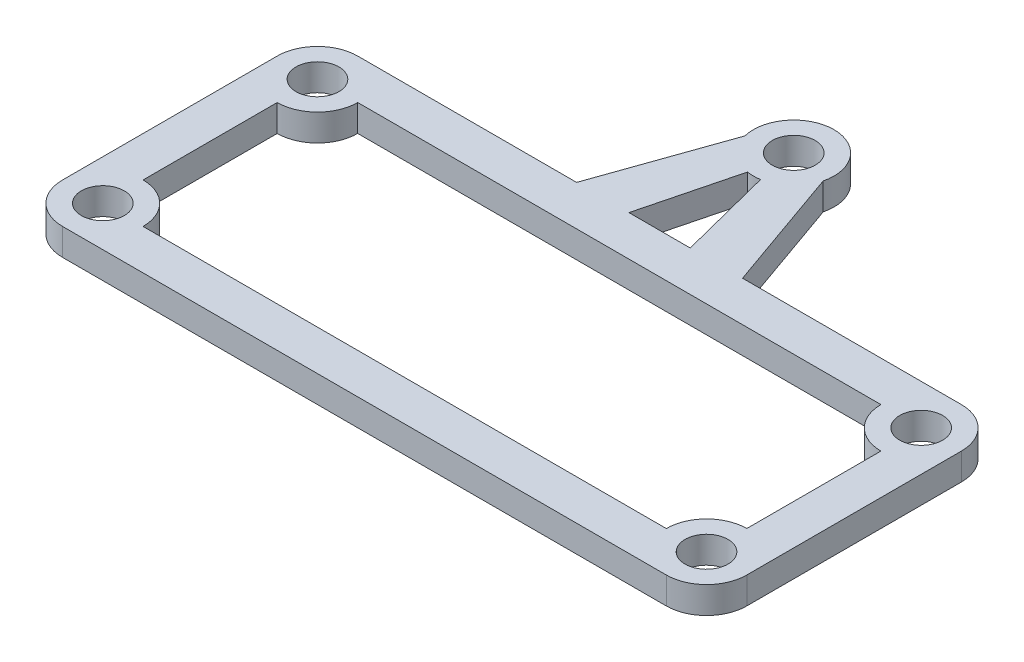
ISO-10303-21;
HEADER;
FILE_DESCRIPTION(('STEP AP214'),'2;1');
FILE_NAME('part.step','',(''),(''),'','','');
FILE_SCHEMA(('AUTOMOTIVE_DESIGN { 1 0 10303 214 1 1 1 1 }'));
ENDSEC;
DATA;
#1=APPLICATION_CONTEXT('core data for automotive mechanical design processes');
#2=APPLICATION_PROTOCOL_DEFINITION('international standard','automotive_design',2000,#1);
#3=PRODUCT_CONTEXT('',#1,'mechanical');
#4=PRODUCT('Part','Part','',(#3));
#5=PRODUCT_RELATED_PRODUCT_CATEGORY('part','',(#4));
#6=PRODUCT_DEFINITION_FORMATION('','',#4);
#7=PRODUCT_DEFINITION_CONTEXT('part definition',#1,'design');
#8=PRODUCT_DEFINITION('design','',#6,#7);
#9=PRODUCT_DEFINITION_SHAPE('','',#8);
#10=(LENGTH_UNIT() NAMED_UNIT(*) SI_UNIT(.MILLI.,.METRE.));
#11=(NAMED_UNIT(*) PLANE_ANGLE_UNIT() SI_UNIT($,.RADIAN.));
#12=(NAMED_UNIT(*) SI_UNIT($,.STERADIAN.) SOLID_ANGLE_UNIT());
#13=UNCERTAINTY_MEASURE_WITH_UNIT(LENGTH_MEASURE(1.E-05),#10,'distance_accuracy_value','');
#14=(GEOMETRIC_REPRESENTATION_CONTEXT(3) GLOBAL_UNCERTAINTY_ASSIGNED_CONTEXT((#13)) GLOBAL_UNIT_ASSIGNED_CONTEXT((#10,
#11,#12)) REPRESENTATION_CONTEXT('',''));
#15=CARTESIAN_POINT('',(0.,0.,0.));
#16=DIRECTION('',(0.,0.,1.));
#17=DIRECTION('',(1.,0.,0.));
#18=AXIS2_PLACEMENT_3D('',#15,#16,#17);
#19=CARTESIAN_POINT('',(22.5,2.,-8.));
#20=DIRECTION('',(0.,1.,0.));
#21=DIRECTION('',(0.,0.,1.));
#22=AXIS2_PLACEMENT_3D('',#19,#20,#21);
#23=PLANE('',#22);
#24=CARTESIAN_POINT('',(22.5,2.,-8.));
#25=DIRECTION('',(0.,1.,0.));
#26=DIRECTION('',(0.,0.,1.));
#27=AXIS2_PLACEMENT_3D('',#24,#25,#26);
#28=CIRCLE('',#27,1.6);
#29=CARTESIAN_POINT('',(22.5,2.,-6.4));
#30=VERTEX_POINT('',#29);
#31=EDGE_CURVE('E295',#30,#30,#28,.T.);
#32=ORIENTED_EDGE('',*,*,#31,.F.);
#33=EDGE_LOOP('',(#32));
#34=FACE_BOUND('',#33,.T.);
#35=CARTESIAN_POINT('',(-22.5,2.,8.));
#36=DIRECTION('',(0.,1.,0.));
#37=DIRECTION('',(0.,0.,1.));
#38=AXIS2_PLACEMENT_3D('',#35,#36,#37);
#39=CIRCLE('',#38,1.6);
#40=CARTESIAN_POINT('',(-22.5,2.,9.6));
#41=VERTEX_POINT('',#40);
#42=EDGE_CURVE('E307',#41,#41,#39,.T.);
#43=ORIENTED_EDGE('',*,*,#42,.F.);
#44=EDGE_LOOP('',(#43));
#45=FACE_BOUND('',#44,.T.);
#46=DIRECTION('',(-0.332613286751948,0.,-0.943063307247221));
#47=VECTOR('',#46,1.);
#48=CARTESIAN_POINT('',(2.91219709152481,2.,-20.2795084316146));
#49=LINE('',#48,#47);
#50=CARTESIAN_POINT('',(6.18502912216667,2.,-11.));
#51=VERTEX_POINT('',#50);
#52=CARTESIAN_POINT('',(2.91219709152481,2.,-20.2795084316146));
#53=VERTEX_POINT('',#52);
#54=EDGE_CURVE('E319',#51,#53,#49,.T.);
#55=ORIENTED_EDGE('',*,*,#54,.T.);
#56=CARTESIAN_POINT('',(0.,2.,-21.));
#57=DIRECTION('',(0.,1.,0.));
#58=DIRECTION('',(0.,0.,1.));
#59=AXIS2_PLACEMENT_3D('',#56,#57,#58);
#60=CIRCLE('',#59,3.);
#61=CARTESIAN_POINT('',(-2.91219709152481,2.,-20.2795084316146));
#62=VERTEX_POINT('',#61);
#63=EDGE_CURVE('E322',#53,#62,#60,.T.);
#64=ORIENTED_EDGE('',*,*,#63,.T.);
#65=DIRECTION('',(-0.332613286751948,0.,0.943063307247221));
#66=VECTOR('',#65,1.);
#67=CARTESIAN_POINT('',(-2.91219709152481,2.,-20.2795084316146));
#68=LINE('',#67,#66);
#69=CARTESIAN_POINT('',(-6.18502912216668,2.,-11.));
#70=VERTEX_POINT('',#69);
#71=EDGE_CURVE('E325',#62,#70,#68,.T.);
#72=ORIENTED_EDGE('',*,*,#71,.T.);
#73=DIRECTION('',(-1.,0.,0.));
#74=VECTOR('',#73,1.);
#75=CARTESIAN_POINT('',(-22.5,2.,-11.));
#76=LINE('',#75,#74);
#77=CARTESIAN_POINT('',(-22.5,2.,-11.));
#78=VERTEX_POINT('',#77);
#79=EDGE_CURVE('E327',#70,#78,#76,.T.);
#80=ORIENTED_EDGE('',*,*,#79,.T.);
#81=CARTESIAN_POINT('',(-22.5,2.,-8.));
#82=DIRECTION('',(0.,1.,0.));
#83=DIRECTION('',(0.,0.,1.));
#84=AXIS2_PLACEMENT_3D('',#81,#82,#83);
#85=CIRCLE('',#84,3.);
#86=CARTESIAN_POINT('',(-25.5,2.,-8.));
#87=VERTEX_POINT('',#86);
#88=EDGE_CURVE('E329',#78,#87,#85,.T.);
#89=ORIENTED_EDGE('',*,*,#88,.T.);
#90=DIRECTION('',(0.,0.,1.));
#91=VECTOR('',#90,1.);
#92=CARTESIAN_POINT('',(-25.5,2.,-8.));
#93=LINE('',#92,#91);
#94=CARTESIAN_POINT('',(-25.5,2.,8.));
#95=VERTEX_POINT('',#94);
#96=EDGE_CURVE('E331',#87,#95,#93,.T.);
#97=ORIENTED_EDGE('',*,*,#96,.T.);
#98=CARTESIAN_POINT('',(-22.5,2.,8.));
#99=DIRECTION('',(0.,1.,0.));
#100=DIRECTION('',(0.,0.,1.));
#101=AXIS2_PLACEMENT_3D('',#98,#99,#100);
#102=CIRCLE('',#101,3.);
#103=CARTESIAN_POINT('',(-22.5,2.,11.));
#104=VERTEX_POINT('',#103);
#105=EDGE_CURVE('E333',#95,#104,#102,.T.);
#106=ORIENTED_EDGE('',*,*,#105,.T.);
#107=DIRECTION('',(1.,0.,0.));
#108=VECTOR('',#107,1.);
#109=CARTESIAN_POINT('',(-22.5,2.,11.));
#110=LINE('',#109,#108);
#111=CARTESIAN_POINT('',(22.5,2.,11.));
#112=VERTEX_POINT('',#111);
#113=EDGE_CURVE('E335',#104,#112,#110,.T.);
#114=ORIENTED_EDGE('',*,*,#113,.T.);
#115=CARTESIAN_POINT('',(22.5,2.,8.));
#116=DIRECTION('',(0.,1.,0.));
#117=DIRECTION('',(0.,0.,1.));
#118=AXIS2_PLACEMENT_3D('',#115,#116,#117);
#119=CIRCLE('',#118,3.);
#120=CARTESIAN_POINT('',(25.5,2.,8.));
#121=VERTEX_POINT('',#120);
#122=EDGE_CURVE('E337',#112,#121,#119,.T.);
#123=ORIENTED_EDGE('',*,*,#122,.T.);
#124=DIRECTION('',(0.,0.,-1.));
#125=VECTOR('',#124,1.);
#126=CARTESIAN_POINT('',(25.5,2.,8.));
#127=LINE('',#126,#125);
#128=CARTESIAN_POINT('',(25.5,2.,-8.));
#129=VERTEX_POINT('',#128);
#130=EDGE_CURVE('E339',#121,#129,#127,.T.);
#131=ORIENTED_EDGE('',*,*,#130,.T.);
#132=CARTESIAN_POINT('',(22.5,2.,-8.));
#133=DIRECTION('',(0.,1.,0.));
#134=DIRECTION('',(0.,0.,1.));
#135=AXIS2_PLACEMENT_3D('',#132,#133,#134);
#136=CIRCLE('',#135,3.);
#137=CARTESIAN_POINT('',(22.5,2.,-11.));
#138=VERTEX_POINT('',#137);
#139=EDGE_CURVE('E341',#129,#138,#136,.T.);
#140=ORIENTED_EDGE('',*,*,#139,.T.);
#141=DIRECTION('',(-1.,0.,0.));
#142=VECTOR('',#141,1.);
#143=CARTESIAN_POINT('',(6.18502912216667,2.,-11.));
#144=LINE('',#143,#142);
#145=EDGE_CURVE('E343',#138,#51,#144,.T.);
#146=ORIENTED_EDGE('',*,*,#145,.T.);
#147=EDGE_LOOP('',(#55,#64,#72,#80,#89,#97,#106,#114,#123,#131,#140,#146));
#148=FACE_BOUND('',#147,.T.);
#149=CARTESIAN_POINT('',(-22.5,2.,-8.));
#150=DIRECTION('',(0.,1.,0.));
#151=DIRECTION('',(0.,0.,1.));
#152=AXIS2_PLACEMENT_3D('',#149,#150,#151);
#153=CIRCLE('',#152,1.6);
#154=CARTESIAN_POINT('',(-22.5,2.,-6.4));
#155=VERTEX_POINT('',#154);
#156=EDGE_CURVE('E313',#155,#155,#153,.T.);
#157=ORIENTED_EDGE('',*,*,#156,.F.);
#158=EDGE_LOOP('',(#157));
#159=FACE_BOUND('',#158,.T.);
#160=CARTESIAN_POINT('',(22.5,2.,8.));
#161=DIRECTION('',(0.,1.,0.));
#162=DIRECTION('',(0.,0.,1.));
#163=AXIS2_PLACEMENT_3D('',#160,#161,#162);
#164=CIRCLE('',#163,1.6);
#165=CARTESIAN_POINT('',(22.5,2.,9.6));
#166=VERTEX_POINT('',#165);
#167=EDGE_CURVE('E301',#166,#166,#164,.T.);
#168=ORIENTED_EDGE('',*,*,#167,.F.);
#169=EDGE_LOOP('',(#168));
#170=FACE_BOUND('',#169,.T.);
#171=CARTESIAN_POINT('',(0.,2.,-21.));
#172=DIRECTION('',(0.,1.,0.));
#173=DIRECTION('',(0.,0.,1.));
#174=AXIS2_PLACEMENT_3D('',#171,#172,#173);
#175=CIRCLE('',#174,1.6);
#176=CARTESIAN_POINT('',(0.,2.,-19.4));
#177=VERTEX_POINT('',#176);
#178=EDGE_CURVE('E289',#177,#177,#175,.T.);
#179=ORIENTED_EDGE('',*,*,#178,.F.);
#180=EDGE_LOOP('',(#179));
#181=FACE_BOUND('',#180,.T.);
#182=DIRECTION('',(-1.,0.,0.));
#183=VECTOR('',#182,1.);
#184=CARTESIAN_POINT('',(-19.5,2.,-8.));
#185=LINE('',#184,#183);
#186=CARTESIAN_POINT('',(19.5,2.,-8.));
#187=VERTEX_POINT('',#186);
#188=CARTESIAN_POINT('',(-19.5,2.,-8.));
#189=VERTEX_POINT('',#188);
#190=EDGE_CURVE('E232',#187,#189,#185,.T.);
#191=ORIENTED_EDGE('',*,*,#190,.F.);
#192=CARTESIAN_POINT('',(22.5,2.,-8.));
#193=DIRECTION('',(0.,-1.,0.));
#194=DIRECTION('',(0.,0.,1.));
#195=AXIS2_PLACEMENT_3D('',#192,#193,#194);
#196=CIRCLE('',#195,3.);
#197=CARTESIAN_POINT('',(22.5,2.,-5.));
#198=VERTEX_POINT('',#197);
#199=EDGE_CURVE('E230',#198,#187,#196,.T.);
#200=ORIENTED_EDGE('',*,*,#199,.F.);
#201=DIRECTION('',(0.,0.,-1.));
#202=VECTOR('',#201,1.);
#203=CARTESIAN_POINT('',(22.5,2.,5.));
#204=LINE('',#203,#202);
#205=CARTESIAN_POINT('',(22.5,2.,5.));
#206=VERTEX_POINT('',#205);
#207=EDGE_CURVE('E246',#206,#198,#204,.T.);
#208=ORIENTED_EDGE('',*,*,#207,.F.);
#209=CARTESIAN_POINT('',(22.5,2.,8.));
#210=DIRECTION('',(0.,-1.,0.));
#211=DIRECTION('',(0.,0.,1.));
#212=AXIS2_PLACEMENT_3D('',#209,#210,#211);
#213=CIRCLE('',#212,3.);
#214=CARTESIAN_POINT('',(19.5,2.,8.));
#215=VERTEX_POINT('',#214);
#216=EDGE_CURVE('E243',#215,#206,#213,.T.);
#217=ORIENTED_EDGE('',*,*,#216,.F.);
#218=DIRECTION('',(1.,0.,0.));
#219=VECTOR('',#218,1.);
#220=CARTESIAN_POINT('',(-19.5,2.,8.));
#221=LINE('',#220,#219);
#222=CARTESIAN_POINT('',(-19.5,2.,8.));
#223=VERTEX_POINT('',#222);
#224=EDGE_CURVE('E241',#223,#215,#221,.T.);
#225=ORIENTED_EDGE('',*,*,#224,.F.);
#226=CARTESIAN_POINT('',(-22.5,2.,8.));
#227=DIRECTION('',(0.,-1.,0.));
#228=DIRECTION('',(0.,0.,1.));
#229=AXIS2_PLACEMENT_3D('',#226,#227,#228);
#230=CIRCLE('',#229,3.);
#231=CARTESIAN_POINT('',(-22.5,2.,5.));
#232=VERTEX_POINT('',#231);
#233=EDGE_CURVE('E239',#232,#223,#230,.T.);
#234=ORIENTED_EDGE('',*,*,#233,.F.);
#235=DIRECTION('',(0.,0.,1.));
#236=VECTOR('',#235,1.);
#237=CARTESIAN_POINT('',(-22.5,2.,5.));
#238=LINE('',#237,#236);
#239=CARTESIAN_POINT('',(-22.5,2.,-5.));
#240=VERTEX_POINT('',#239);
#241=EDGE_CURVE('E237',#240,#232,#238,.T.);
#242=ORIENTED_EDGE('',*,*,#241,.F.);
#243=CARTESIAN_POINT('',(-22.5,2.,-8.));
#244=DIRECTION('',(0.,-1.,0.));
#245=DIRECTION('',(0.,0.,1.));
#246=AXIS2_PLACEMENT_3D('',#243,#244,#245);
#247=CIRCLE('',#246,3.);
#248=EDGE_CURVE('E235',#189,#240,#247,.T.);
#249=ORIENTED_EDGE('',*,*,#248,.F.);
#250=EDGE_LOOP('',(#191,#200,#208,#217,#225,#234,#242,#249));
#251=FACE_BOUND('',#250,.T.);
#252=DIRECTION('',(-0.247458921826023,0.,0.968898385801474));
#253=VECTOR('',#252,1.);
#254=CARTESIAN_POINT('',(-0.487430467790979,2.,-18.039862918872));
#255=LINE('',#254,#253);
#256=CARTESIAN_POINT('',(-0.487430467790979,2.,-18.039862918872));
#257=VERTEX_POINT('',#256);
#258=CARTESIAN_POINT('',(-2.28542798046721,2.,-11.));
#259=VERTEX_POINT('',#258);
#260=EDGE_CURVE('E202',#257,#259,#255,.T.);
#261=ORIENTED_EDGE('',*,*,#260,.F.);
#262=CARTESIAN_POINT('',(0.,2.,-21.));
#263=DIRECTION('',(0.,-1.,0.));
#264=DIRECTION('',(0.,0.,1.));
#265=AXIS2_PLACEMENT_3D('',#262,#263,#264);
#266=CIRCLE('',#265,3.);
#267=CARTESIAN_POINT('',(0.487430467790978,2.,-18.039862918872));
#268=VERTEX_POINT('',#267);
#269=EDGE_CURVE('E194',#268,#257,#266,.T.);
#270=ORIENTED_EDGE('',*,*,#269,.F.);
#271=DIRECTION('',(-0.247458921826023,0.,-0.968898385801474));
#272=VECTOR('',#271,1.);
#273=CARTESIAN_POINT('',(2.28542798046721,2.,-11.));
#274=LINE('',#273,#272);
#275=CARTESIAN_POINT('',(2.28542798046721,2.,-11.));
#276=VERTEX_POINT('',#275);
#277=EDGE_CURVE('E216',#276,#268,#274,.T.);
#278=ORIENTED_EDGE('',*,*,#277,.F.);
#279=DIRECTION('',(1.,0.,0.));
#280=VECTOR('',#279,1.);
#281=CARTESIAN_POINT('',(-2.28542798046721,2.,-11.));
#282=LINE('',#281,#280);
#283=EDGE_CURVE('E214',#259,#276,#282,.T.);
#284=ORIENTED_EDGE('',*,*,#283,.F.);
#285=EDGE_LOOP('',(#261,#270,#278,#284));
#286=FACE_BOUND('',#285,.T.);
#287=ADVANCED_FACE('F33',(#34,#45,#148,#159,#170,#181,#251,#286),#23,.T.);
#288=CARTESIAN_POINT('',(22.5,0.,-8.));
#289=DIRECTION('',(0.,1.,0.));
#290=DIRECTION('',(0.,0.,1.));
#291=AXIS2_PLACEMENT_3D('',#288,#289,#290);
#292=PLANE('',#291);
#293=CARTESIAN_POINT('',(22.5,0.,-8.));
#294=DIRECTION('',(0.,-1.,0.));
#295=DIRECTION('',(0.,0.,1.));
#296=AXIS2_PLACEMENT_3D('',#293,#294,#295);
#297=CIRCLE('',#296,3.);
#298=CARTESIAN_POINT('',(22.5,0.,-5.));
#299=VERTEX_POINT('',#298);
#300=CARTESIAN_POINT('',(19.5,0.,-8.));
#301=VERTEX_POINT('',#300);
#302=EDGE_CURVE('E210',#299,#301,#297,.T.);
#303=ORIENTED_EDGE('',*,*,#302,.T.);
#304=DIRECTION('',(-1.,0.,0.));
#305=VECTOR('',#304,1.);
#306=CARTESIAN_POINT('',(-19.5,0.,-8.));
#307=LINE('',#306,#305);
#308=CARTESIAN_POINT('',(-19.5,0.,-8.));
#309=VERTEX_POINT('',#308);
#310=EDGE_CURVE('E251',#301,#309,#307,.T.);
#311=ORIENTED_EDGE('',*,*,#310,.T.);
#312=CARTESIAN_POINT('',(-22.5,0.,-8.));
#313=DIRECTION('',(0.,-1.,0.));
#314=DIRECTION('',(0.,0.,1.));
#315=AXIS2_PLACEMENT_3D('',#312,#313,#314);
#316=CIRCLE('',#315,3.);
#317=CARTESIAN_POINT('',(-22.5,0.,-5.));
#318=VERTEX_POINT('',#317);
#319=EDGE_CURVE('E254',#309,#318,#316,.T.);
#320=ORIENTED_EDGE('',*,*,#319,.T.);
#321=DIRECTION('',(0.,0.,1.));
#322=VECTOR('',#321,1.);
#323=CARTESIAN_POINT('',(-22.5,0.,5.));
#324=LINE('',#323,#322);
#325=CARTESIAN_POINT('',(-22.5,0.,5.));
#326=VERTEX_POINT('',#325);
#327=EDGE_CURVE('E257',#318,#326,#324,.T.);
#328=ORIENTED_EDGE('',*,*,#327,.T.);
#329=CARTESIAN_POINT('',(-22.5,0.,8.));
#330=DIRECTION('',(0.,-1.,0.));
#331=DIRECTION('',(0.,0.,1.));
#332=AXIS2_PLACEMENT_3D('',#329,#330,#331);
#333=CIRCLE('',#332,3.);
#334=CARTESIAN_POINT('',(-19.5,0.,8.));
#335=VERTEX_POINT('',#334);
#336=EDGE_CURVE('E260',#326,#335,#333,.T.);
#337=ORIENTED_EDGE('',*,*,#336,.T.);
#338=DIRECTION('',(1.,0.,0.));
#339=VECTOR('',#338,1.);
#340=CARTESIAN_POINT('',(-19.5,0.,8.));
#341=LINE('',#340,#339);
#342=CARTESIAN_POINT('',(19.5,0.,8.));
#343=VERTEX_POINT('',#342);
#344=EDGE_CURVE('E263',#335,#343,#341,.T.);
#345=ORIENTED_EDGE('',*,*,#344,.T.);
#346=CARTESIAN_POINT('',(22.5,0.,8.));
#347=DIRECTION('',(0.,-1.,0.));
#348=DIRECTION('',(0.,0.,1.));
#349=AXIS2_PLACEMENT_3D('',#346,#347,#348);
#350=CIRCLE('',#349,3.);
#351=CARTESIAN_POINT('',(22.5,0.,5.));
#352=VERTEX_POINT('',#351);
#353=EDGE_CURVE('E266',#343,#352,#350,.T.);
#354=ORIENTED_EDGE('',*,*,#353,.T.);
#355=DIRECTION('',(0.,0.,-1.));
#356=VECTOR('',#355,1.);
#357=CARTESIAN_POINT('',(22.5,0.,5.));
#358=LINE('',#357,#356);
#359=EDGE_CURVE('E233',#352,#299,#358,.T.);
#360=ORIENTED_EDGE('',*,*,#359,.T.);
#361=EDGE_LOOP('',(#303,#311,#320,#328,#337,#345,#354,#360));
#362=FACE_BOUND('',#361,.T.);
#363=DIRECTION('',(-0.332613286751948,0.,-0.943063307247221));
#364=VECTOR('',#363,1.);
#365=CARTESIAN_POINT('',(2.91219709152481,0.,-20.2795084316146));
#366=LINE('',#365,#364);
#367=CARTESIAN_POINT('',(6.18502912216667,0.,-11.));
#368=VERTEX_POINT('',#367);
#369=CARTESIAN_POINT('',(2.91219709152481,0.,-20.2795084316146));
#370=VERTEX_POINT('',#369);
#371=EDGE_CURVE('E316',#368,#370,#366,.T.);
#372=ORIENTED_EDGE('',*,*,#371,.F.);
#373=DIRECTION('',(-1.,0.,0.));
#374=VECTOR('',#373,1.);
#375=CARTESIAN_POINT('',(6.18502912216667,0.,-11.));
#376=LINE('',#375,#374);
#377=CARTESIAN_POINT('',(22.5,0.,-11.));
#378=VERTEX_POINT('',#377);
#379=EDGE_CURVE('E323',#378,#368,#376,.T.);
#380=ORIENTED_EDGE('',*,*,#379,.F.);
#381=CARTESIAN_POINT('',(22.5,0.,-8.));
#382=DIRECTION('',(0.,1.,0.));
#383=DIRECTION('',(0.,0.,1.));
#384=AXIS2_PLACEMENT_3D('',#381,#382,#383);
#385=CIRCLE('',#384,3.);
#386=CARTESIAN_POINT('',(25.5,0.,-8.));
#387=VERTEX_POINT('',#386);
#388=EDGE_CURVE('E366',#387,#378,#385,.T.);
#389=ORIENTED_EDGE('',*,*,#388,.F.);
#390=DIRECTION('',(0.,0.,-1.));
#391=VECTOR('',#390,1.);
#392=CARTESIAN_POINT('',(25.5,0.,8.));
#393=LINE('',#392,#391);
#394=CARTESIAN_POINT('',(25.5,0.,8.));
#395=VERTEX_POINT('',#394);
#396=EDGE_CURVE('E364',#395,#387,#393,.T.);
#397=ORIENTED_EDGE('',*,*,#396,.F.);
#398=CARTESIAN_POINT('',(22.5,0.,8.));
#399=DIRECTION('',(0.,1.,0.));
#400=DIRECTION('',(0.,0.,1.));
#401=AXIS2_PLACEMENT_3D('',#398,#399,#400);
#402=CIRCLE('',#401,3.);
#403=CARTESIAN_POINT('',(22.5,0.,11.));
#404=VERTEX_POINT('',#403);
#405=EDGE_CURVE('E362',#404,#395,#402,.T.);
#406=ORIENTED_EDGE('',*,*,#405,.F.);
#407=DIRECTION('',(1.,0.,0.));
#408=VECTOR('',#407,1.);
#409=CARTESIAN_POINT('',(-22.5,0.,11.));
#410=LINE('',#409,#408);
#411=CARTESIAN_POINT('',(-22.5,0.,11.));
#412=VERTEX_POINT('',#411);
#413=EDGE_CURVE('E360',#412,#404,#410,.T.);
#414=ORIENTED_EDGE('',*,*,#413,.F.);
#415=CARTESIAN_POINT('',(-22.5,0.,8.));
#416=DIRECTION('',(0.,1.,0.));
#417=DIRECTION('',(0.,0.,1.));
#418=AXIS2_PLACEMENT_3D('',#415,#416,#417);
#419=CIRCLE('',#418,3.);
#420=CARTESIAN_POINT('',(-25.5,0.,8.));
#421=VERTEX_POINT('',#420);
#422=EDGE_CURVE('E358',#421,#412,#419,.T.);
#423=ORIENTED_EDGE('',*,*,#422,.F.);
#424=DIRECTION('',(0.,0.,1.));
#425=VECTOR('',#424,1.);
#426=CARTESIAN_POINT('',(-25.5,0.,-8.));
#427=LINE('',#426,#425);
#428=CARTESIAN_POINT('',(-25.5,0.,-8.));
#429=VERTEX_POINT('',#428);
#430=EDGE_CURVE('E356',#429,#421,#427,.T.);
#431=ORIENTED_EDGE('',*,*,#430,.F.);
#432=CARTESIAN_POINT('',(-22.5,0.,-8.));
#433=DIRECTION('',(0.,1.,0.));
#434=DIRECTION('',(0.,0.,1.));
#435=AXIS2_PLACEMENT_3D('',#432,#433,#434);
#436=CIRCLE('',#435,3.);
#437=CARTESIAN_POINT('',(-22.5,0.,-11.));
#438=VERTEX_POINT('',#437);
#439=EDGE_CURVE('E354',#438,#429,#436,.T.);
#440=ORIENTED_EDGE('',*,*,#439,.F.);
#441=DIRECTION('',(-1.,0.,0.));
#442=VECTOR('',#441,1.);
#443=CARTESIAN_POINT('',(-22.5,0.,-11.));
#444=LINE('',#443,#442);
#445=CARTESIAN_POINT('',(-6.18502912216668,0.,-11.));
#446=VERTEX_POINT('',#445);
#447=EDGE_CURVE('E352',#446,#438,#444,.T.);
#448=ORIENTED_EDGE('',*,*,#447,.F.);
#449=DIRECTION('',(-0.332613286751948,0.,0.943063307247221));
#450=VECTOR('',#449,1.);
#451=CARTESIAN_POINT('',(-2.91219709152481,0.,-20.2795084316146));
#452=LINE('',#451,#450);
#453=CARTESIAN_POINT('',(-2.91219709152481,0.,-20.2795084316146));
#454=VERTEX_POINT('',#453);
#455=EDGE_CURVE('E350',#454,#446,#452,.T.);
#456=ORIENTED_EDGE('',*,*,#455,.F.);
#457=CARTESIAN_POINT('',(0.,0.,-21.));
#458=DIRECTION('',(0.,1.,0.));
#459=DIRECTION('',(0.,0.,1.));
#460=AXIS2_PLACEMENT_3D('',#457,#458,#459);
#461=CIRCLE('',#460,3.);
#462=EDGE_CURVE('E348',#370,#454,#461,.T.);
#463=ORIENTED_EDGE('',*,*,#462,.F.);
#464=EDGE_LOOP('',(#372,#380,#389,#397,#406,#414,#423,#431,#440,#448,#456,#463));
#465=FACE_BOUND('',#464,.T.);
#466=CARTESIAN_POINT('',(-22.5,0.,-8.));
#467=DIRECTION('',(0.,1.,0.));
#468=DIRECTION('',(0.,0.,1.));
#469=AXIS2_PLACEMENT_3D('',#466,#467,#468);
#470=CIRCLE('',#469,1.6);
#471=CARTESIAN_POINT('',(-22.5,0.,-6.4));
#472=VERTEX_POINT('',#471);
#473=EDGE_CURVE('E310',#472,#472,#470,.T.);
#474=ORIENTED_EDGE('',*,*,#473,.T.);
#475=EDGE_LOOP('',(#474));
#476=FACE_BOUND('',#475,.T.);
#477=CARTESIAN_POINT('',(-22.5,0.,8.));
#478=DIRECTION('',(0.,1.,0.));
#479=DIRECTION('',(0.,0.,1.));
#480=AXIS2_PLACEMENT_3D('',#477,#478,#479);
#481=CIRCLE('',#480,1.6);
#482=CARTESIAN_POINT('',(-22.5,0.,9.6));
#483=VERTEX_POINT('',#482);
#484=EDGE_CURVE('E304',#483,#483,#481,.T.);
#485=ORIENTED_EDGE('',*,*,#484,.T.);
#486=EDGE_LOOP('',(#485));
#487=FACE_BOUND('',#486,.T.);
#488=CARTESIAN_POINT('',(22.5,0.,8.));
#489=DIRECTION('',(0.,1.,0.));
#490=DIRECTION('',(0.,0.,1.));
#491=AXIS2_PLACEMENT_3D('',#488,#489,#490);
#492=CIRCLE('',#491,1.6);
#493=CARTESIAN_POINT('',(22.5,0.,9.6));
#494=VERTEX_POINT('',#493);
#495=EDGE_CURVE('E298',#494,#494,#492,.T.);
#496=ORIENTED_EDGE('',*,*,#495,.T.);
#497=EDGE_LOOP('',(#496));
#498=FACE_BOUND('',#497,.T.);
#499=CARTESIAN_POINT('',(22.5,0.,-8.));
#500=DIRECTION('',(0.,1.,0.));
#501=DIRECTION('',(0.,0.,1.));
#502=AXIS2_PLACEMENT_3D('',#499,#500,#501);
#503=CIRCLE('',#502,1.6);
#504=CARTESIAN_POINT('',(22.5,0.,-6.4));
#505=VERTEX_POINT('',#504);
#506=EDGE_CURVE('E292',#505,#505,#503,.T.);
#507=ORIENTED_EDGE('',*,*,#506,.T.);
#508=EDGE_LOOP('',(#507));
#509=FACE_BOUND('',#508,.T.);
#510=CARTESIAN_POINT('',(0.,0.,-21.));
#511=DIRECTION('',(0.,1.,0.));
#512=DIRECTION('',(0.,0.,1.));
#513=AXIS2_PLACEMENT_3D('',#510,#511,#512);
#514=CIRCLE('',#513,1.6);
#515=CARTESIAN_POINT('',(0.,0.,-19.4));
#516=VERTEX_POINT('',#515);
#517=EDGE_CURVE('E288',#516,#516,#514,.T.);
#518=ORIENTED_EDGE('',*,*,#517,.T.);
#519=EDGE_LOOP('',(#518));
#520=FACE_BOUND('',#519,.T.);
#521=CARTESIAN_POINT('',(0.,0.,-21.));
#522=DIRECTION('',(0.,-1.,0.));
#523=DIRECTION('',(0.,0.,1.));
#524=AXIS2_PLACEMENT_3D('',#521,#522,#523);
#525=CIRCLE('',#524,3.);
#526=CARTESIAN_POINT('',(0.487430467790979,0.,-18.039862918872));
#527=VERTEX_POINT('',#526);
#528=CARTESIAN_POINT('',(-0.487430467790979,0.,-18.039862918872));
#529=VERTEX_POINT('',#528);
#530=EDGE_CURVE('E56',#527,#529,#525,.T.);
#531=ORIENTED_EDGE('',*,*,#530,.T.);
#532=DIRECTION('',(-0.247458921826023,0.,0.968898385801474));
#533=VECTOR('',#532,1.);
#534=CARTESIAN_POINT('',(-0.487430467790979,0.,-18.039862918872));
#535=LINE('',#534,#533);
#536=CARTESIAN_POINT('',(-2.28542798046721,0.,-11.));
#537=VERTEX_POINT('',#536);
#538=EDGE_CURVE('E209',#529,#537,#535,.T.);
#539=ORIENTED_EDGE('',*,*,#538,.T.);
#540=DIRECTION('',(1.,0.,0.));
#541=VECTOR('',#540,1.);
#542=CARTESIAN_POINT('',(-2.28542798046721,0.,-11.));
#543=LINE('',#542,#541);
#544=CARTESIAN_POINT('',(2.28542798046721,0.,-11.));
#545=VERTEX_POINT('',#544);
#546=EDGE_CURVE('E222',#537,#545,#543,.T.);
#547=ORIENTED_EDGE('',*,*,#546,.T.);
#548=DIRECTION('',(-0.247458921826023,0.,-0.968898385801474));
#549=VECTOR('',#548,1.);
#550=CARTESIAN_POINT('',(2.28542798046721,0.,-11.));
#551=LINE('',#550,#549);
#552=EDGE_CURVE('E203',#545,#527,#551,.T.);
#553=ORIENTED_EDGE('',*,*,#552,.T.);
#554=EDGE_LOOP('',(#531,#539,#547,#553));
#555=FACE_BOUND('',#554,.T.);
#556=ADVANCED_FACE('F408',(#362,#465,#476,#487,#498,#509,#520,#555),#292,.F.);
#557=CARTESIAN_POINT('',(2.91219709152481,2.,-20.2795084316146));
#558=DIRECTION('',(-0.943063307247221,0.,0.332613286751948));
#559=DIRECTION('',(0.332613286751948,0.,0.943063307247221));
#560=AXIS2_PLACEMENT_3D('',#557,#558,#559);
#561=PLANE('',#560);
#562=ORIENTED_EDGE('',*,*,#371,.T.);
#563=DIRECTION('',(0.,-1.,0.));
#564=VECTOR('',#563,1.);
#565=CARTESIAN_POINT('',(2.91219709152481,2.,-20.2795084316146));
#566=LINE('',#565,#564);
#567=EDGE_CURVE('E11',#53,#370,#566,.T.);
#568=ORIENTED_EDGE('',*,*,#567,.F.);
#569=ORIENTED_EDGE('',*,*,#54,.F.);
#570=DIRECTION('',(0.,-1.,0.));
#571=VECTOR('',#570,1.);
#572=CARTESIAN_POINT('',(6.18502912216667,2.,-11.));
#573=LINE('',#572,#571);
#574=EDGE_CURVE('E345',#51,#368,#573,.T.);
#575=ORIENTED_EDGE('',*,*,#574,.T.);
#576=EDGE_LOOP('',(#562,#568,#569,#575));
#577=FACE_BOUND('',#576,.T.);
#578=ADVANCED_FACE('F35',(#577),#561,.F.);
#579=CARTESIAN_POINT('',(0.,2.,-21.));
#580=DIRECTION('',(0.,-1.,0.));
#581=DIRECTION('',(0.,0.,-1.));
#582=AXIS2_PLACEMENT_3D('',#579,#580,#581);
#583=CYLINDRICAL_SURFACE('',#582,3.);
#584=ORIENTED_EDGE('',*,*,#462,.T.);
#585=DIRECTION('',(0.,-1.,0.));
#586=VECTOR('',#585,1.);
#587=CARTESIAN_POINT('',(-2.91219709152481,2.,-20.2795084316146));
#588=LINE('',#587,#586);
#589=EDGE_CURVE('E41',#62,#454,#588,.T.);
#590=ORIENTED_EDGE('',*,*,#589,.F.);
#591=ORIENTED_EDGE('',*,*,#63,.F.);
#592=ORIENTED_EDGE('',*,*,#567,.T.);
#593=EDGE_LOOP('',(#584,#590,#591,#592));
#594=FACE_BOUND('',#593,.T.);
#595=ADVANCED_FACE('F426',(#594),#583,.T.);
#596=CARTESIAN_POINT('',(-2.91219709152481,2.,-20.2795084316146));
#597=DIRECTION('',(0.943063307247221,0.,0.332613286751949));
#598=DIRECTION('',(0.332613286751949,0.,-0.943063307247221));
#599=AXIS2_PLACEMENT_3D('',#596,#597,#598);
#600=PLANE('',#599);
#601=ORIENTED_EDGE('',*,*,#455,.T.);
#602=DIRECTION('',(0.,-1.,0.));
#603=VECTOR('',#602,1.);
#604=CARTESIAN_POINT('',(-6.18502912216668,2.,-11.));
#605=LINE('',#604,#603);
#606=EDGE_CURVE('E395',#70,#446,#605,.T.);
#607=ORIENTED_EDGE('',*,*,#606,.F.);
#608=ORIENTED_EDGE('',*,*,#71,.F.);
#609=ORIENTED_EDGE('',*,*,#589,.T.);
#610=EDGE_LOOP('',(#601,#607,#608,#609));
#611=FACE_BOUND('',#610,.T.);
#612=ADVANCED_FACE('F402',(#611),#600,.F.);
#613=CARTESIAN_POINT('',(-22.5,2.,-11.));
#614=DIRECTION('',(0.,0.,1.));
#615=DIRECTION('',(1.,0.,0.));
#616=AXIS2_PLACEMENT_3D('',#613,#614,#615);
#617=PLANE('',#616);
#618=ORIENTED_EDGE('',*,*,#447,.T.);
#619=DIRECTION('',(0.,-1.,0.));
#620=VECTOR('',#619,1.);
#621=CARTESIAN_POINT('',(-22.5,2.,-11.));
#622=LINE('',#621,#620);
#623=EDGE_CURVE('E392',#78,#438,#622,.T.);
#624=ORIENTED_EDGE('',*,*,#623,.F.);
#625=ORIENTED_EDGE('',*,*,#79,.F.);
#626=ORIENTED_EDGE('',*,*,#606,.T.);
#627=EDGE_LOOP('',(#618,#624,#625,#626));
#628=FACE_BOUND('',#627,.T.);
#629=ADVANCED_FACE('F414',(#628),#617,.F.);
#630=CARTESIAN_POINT('',(-22.5,2.,-8.));
#631=DIRECTION('',(0.,-1.,0.));
#632=DIRECTION('',(0.,0.,-1.));
#633=AXIS2_PLACEMENT_3D('',#630,#631,#632);
#634=CYLINDRICAL_SURFACE('',#633,3.);
#635=ORIENTED_EDGE('',*,*,#439,.T.);
#636=DIRECTION('',(0.,-1.,0.));
#637=VECTOR('',#636,1.);
#638=CARTESIAN_POINT('',(-25.5,2.,-8.));
#639=LINE('',#638,#637);
#640=EDGE_CURVE('E389',#87,#429,#639,.T.);
#641=ORIENTED_EDGE('',*,*,#640,.F.);
#642=ORIENTED_EDGE('',*,*,#88,.F.);
#643=ORIENTED_EDGE('',*,*,#623,.T.);
#644=EDGE_LOOP('',(#635,#641,#642,#643));
#645=FACE_BOUND('',#644,.T.);
#646=ADVANCED_FACE('F418',(#645),#634,.T.);
#647=CARTESIAN_POINT('',(-25.5,2.,-8.));
#648=DIRECTION('',(1.,0.,0.));
#649=DIRECTION('',(0.,0.,-1.));
#650=AXIS2_PLACEMENT_3D('',#647,#648,#649);
#651=PLANE('',#650);
#652=ORIENTED_EDGE('',*,*,#430,.T.);
#653=DIRECTION('',(0.,-1.,0.));
#654=VECTOR('',#653,1.);
#655=CARTESIAN_POINT('',(-25.5,2.,8.));
#656=LINE('',#655,#654);
#657=EDGE_CURVE('E386',#95,#421,#656,.T.);
#658=ORIENTED_EDGE('',*,*,#657,.F.);
#659=ORIENTED_EDGE('',*,*,#96,.F.);
#660=ORIENTED_EDGE('',*,*,#640,.T.);
#661=EDGE_LOOP('',(#652,#658,#659,#660));
#662=FACE_BOUND('',#661,.T.);
#663=ADVANCED_FACE('F459',(#662),#651,.F.);
#664=CARTESIAN_POINT('',(-22.5,2.,8.));
#665=DIRECTION('',(0.,-1.,0.));
#666=DIRECTION('',(0.,0.,-1.));
#667=AXIS2_PLACEMENT_3D('',#664,#665,#666);
#668=CYLINDRICAL_SURFACE('',#667,3.);
#669=ORIENTED_EDGE('',*,*,#422,.T.);
#670=DIRECTION('',(0.,-1.,0.));
#671=VECTOR('',#670,1.);
#672=CARTESIAN_POINT('',(-22.5,2.,11.));
#673=LINE('',#672,#671);
#674=EDGE_CURVE('E383',#104,#412,#673,.T.);
#675=ORIENTED_EDGE('',*,*,#674,.F.);
#676=ORIENTED_EDGE('',*,*,#105,.F.);
#677=ORIENTED_EDGE('',*,*,#657,.T.);
#678=EDGE_LOOP('',(#669,#675,#676,#677));
#679=FACE_BOUND('',#678,.T.);
#680=ADVANCED_FACE('F457',(#679),#668,.T.);
#681=CARTESIAN_POINT('',(-22.5,2.,11.));
#682=DIRECTION('',(0.,0.,-1.));
#683=DIRECTION('',(-1.,0.,0.));
#684=AXIS2_PLACEMENT_3D('',#681,#682,#683);
#685=PLANE('',#684);
#686=ORIENTED_EDGE('',*,*,#413,.T.);
#687=DIRECTION('',(0.,-1.,0.));
#688=VECTOR('',#687,1.);
#689=CARTESIAN_POINT('',(22.5,2.,11.));
#690=LINE('',#689,#688);
#691=EDGE_CURVE('E380',#112,#404,#690,.T.);
#692=ORIENTED_EDGE('',*,*,#691,.F.);
#693=ORIENTED_EDGE('',*,*,#113,.F.);
#694=ORIENTED_EDGE('',*,*,#674,.T.);
#695=EDGE_LOOP('',(#686,#692,#693,#694));
#696=FACE_BOUND('',#695,.T.);
#697=ADVANCED_FACE('F453',(#696),#685,.F.);
#698=CARTESIAN_POINT('',(22.5,2.,8.));
#699=DIRECTION('',(0.,-1.,0.));
#700=DIRECTION('',(0.,0.,-1.));
#701=AXIS2_PLACEMENT_3D('',#698,#699,#700);
#702=CYLINDRICAL_SURFACE('',#701,3.);
#703=ORIENTED_EDGE('',*,*,#405,.T.);
#704=DIRECTION('',(0.,-1.,0.));
#705=VECTOR('',#704,1.);
#706=CARTESIAN_POINT('',(25.5,2.,8.));
#707=LINE('',#706,#705);
#708=EDGE_CURVE('E377',#121,#395,#707,.T.);
#709=ORIENTED_EDGE('',*,*,#708,.F.);
#710=ORIENTED_EDGE('',*,*,#122,.F.);
#711=ORIENTED_EDGE('',*,*,#691,.T.);
#712=EDGE_LOOP('',(#703,#709,#710,#711));
#713=FACE_BOUND('',#712,.T.);
#714=ADVANCED_FACE('F448',(#713),#702,.T.);
#715=CARTESIAN_POINT('',(25.5,2.,8.));
#716=DIRECTION('',(-1.,0.,0.));
#717=DIRECTION('',(0.,0.,1.));
#718=AXIS2_PLACEMENT_3D('',#715,#716,#717);
#719=PLANE('',#718);
#720=ORIENTED_EDGE('',*,*,#396,.T.);
#721=DIRECTION('',(0.,-1.,0.));
#722=VECTOR('',#721,1.);
#723=CARTESIAN_POINT('',(25.5,2.,-8.));
#724=LINE('',#723,#722);
#725=EDGE_CURVE('E374',#129,#387,#724,.T.);
#726=ORIENTED_EDGE('',*,*,#725,.F.);
#727=ORIENTED_EDGE('',*,*,#130,.F.);
#728=ORIENTED_EDGE('',*,*,#708,.T.);
#729=EDGE_LOOP('',(#720,#726,#727,#728));
#730=FACE_BOUND('',#729,.T.);
#731=ADVANCED_FACE('F442',(#730),#719,.F.);
#732=CARTESIAN_POINT('',(22.5,2.,-8.));
#733=DIRECTION('',(0.,-1.,0.));
#734=DIRECTION('',(0.,0.,-1.));
#735=AXIS2_PLACEMENT_3D('',#732,#733,#734);
#736=CYLINDRICAL_SURFACE('',#735,3.);
#737=ORIENTED_EDGE('',*,*,#388,.T.);
#738=DIRECTION('',(0.,-1.,0.));
#739=VECTOR('',#738,1.);
#740=CARTESIAN_POINT('',(22.5,2.,-11.));
#741=LINE('',#740,#739);
#742=EDGE_CURVE('E371',#138,#378,#741,.T.);
#743=ORIENTED_EDGE('',*,*,#742,.F.);
#744=ORIENTED_EDGE('',*,*,#139,.F.);
#745=ORIENTED_EDGE('',*,*,#725,.T.);
#746=EDGE_LOOP('',(#737,#743,#744,#745));
#747=FACE_BOUND('',#746,.T.);
#748=ADVANCED_FACE('F438',(#747),#736,.T.);
#749=CARTESIAN_POINT('',(6.18502912216667,2.,-11.));
#750=DIRECTION('',(0.,0.,1.));
#751=DIRECTION('',(1.,0.,0.));
#752=AXIS2_PLACEMENT_3D('',#749,#750,#751);
#753=PLANE('',#752);
#754=ORIENTED_EDGE('',*,*,#379,.T.);
#755=ORIENTED_EDGE('',*,*,#574,.F.);
#756=ORIENTED_EDGE('',*,*,#145,.F.);
#757=ORIENTED_EDGE('',*,*,#742,.T.);
#758=EDGE_LOOP('',(#754,#755,#756,#757));
#759=FACE_BOUND('',#758,.T.);
#760=ADVANCED_FACE('F433',(#759),#753,.F.);
#761=CARTESIAN_POINT('',(-22.5,2.,-8.));
#762=DIRECTION('',(0.,-1.,0.));
#763=DIRECTION('',(0.,0.,-1.));
#764=AXIS2_PLACEMENT_3D('',#761,#762,#763);
#765=CYLINDRICAL_SURFACE('',#764,1.6);
#766=ORIENTED_EDGE('',*,*,#156,.T.);
#767=EDGE_LOOP('',(#766));
#768=FACE_BOUND('',#767,.T.);
#769=ORIENTED_EDGE('',*,*,#473,.F.);
#770=EDGE_LOOP('',(#769));
#771=FACE_BOUND('',#770,.T.);
#772=ADVANCED_FACE('F479',(#768,#771),#765,.F.);
#773=CARTESIAN_POINT('',(-22.5,2.,8.));
#774=DIRECTION('',(0.,-1.,0.));
#775=DIRECTION('',(0.,0.,-1.));
#776=AXIS2_PLACEMENT_3D('',#773,#774,#775);
#777=CYLINDRICAL_SURFACE('',#776,1.6);
#778=ORIENTED_EDGE('',*,*,#42,.T.);
#779=EDGE_LOOP('',(#778));
#780=FACE_BOUND('',#779,.T.);
#781=ORIENTED_EDGE('',*,*,#484,.F.);
#782=EDGE_LOOP('',(#781));
#783=FACE_BOUND('',#782,.T.);
#784=ADVANCED_FACE('F517',(#780,#783),#777,.F.);
#785=CARTESIAN_POINT('',(22.5,2.,8.));
#786=DIRECTION('',(0.,-1.,0.));
#787=DIRECTION('',(0.,0.,-1.));
#788=AXIS2_PLACEMENT_3D('',#785,#786,#787);
#789=CYLINDRICAL_SURFACE('',#788,1.6);
#790=ORIENTED_EDGE('',*,*,#167,.T.);
#791=EDGE_LOOP('',(#790));
#792=FACE_BOUND('',#791,.T.);
#793=ORIENTED_EDGE('',*,*,#495,.F.);
#794=EDGE_LOOP('',(#793));
#795=FACE_BOUND('',#794,.T.);
#796=ADVANCED_FACE('F524',(#792,#795),#789,.F.);
#797=CARTESIAN_POINT('',(22.5,2.,-8.));
#798=DIRECTION('',(0.,-1.,0.));
#799=DIRECTION('',(0.,0.,-1.));
#800=AXIS2_PLACEMENT_3D('',#797,#798,#799);
#801=CYLINDRICAL_SURFACE('',#800,1.6);
#802=ORIENTED_EDGE('',*,*,#31,.T.);
#803=EDGE_LOOP('',(#802));
#804=FACE_BOUND('',#803,.T.);
#805=ORIENTED_EDGE('',*,*,#506,.F.);
#806=EDGE_LOOP('',(#805));
#807=FACE_BOUND('',#806,.T.);
#808=ADVANCED_FACE('F531',(#804,#807),#801,.F.);
#809=CARTESIAN_POINT('',(0.,2.,-21.));
#810=DIRECTION('',(0.,-1.,0.));
#811=DIRECTION('',(0.,0.,-1.));
#812=AXIS2_PLACEMENT_3D('',#809,#810,#811);
#813=CYLINDRICAL_SURFACE('',#812,1.6);
#814=ORIENTED_EDGE('',*,*,#178,.T.);
#815=EDGE_LOOP('',(#814));
#816=FACE_BOUND('',#815,.T.);
#817=ORIENTED_EDGE('',*,*,#517,.F.);
#818=EDGE_LOOP('',(#817));
#819=FACE_BOUND('',#818,.T.);
#820=ADVANCED_FACE('F539',(#816,#819),#813,.F.);
#821=CARTESIAN_POINT('',(22.5,2.,-8.));
#822=DIRECTION('',(0.,-1.,0.));
#823=DIRECTION('',(0.,0.,-1.));
#824=AXIS2_PLACEMENT_3D('',#821,#822,#823);
#825=CYLINDRICAL_SURFACE('',#824,3.);
#826=ORIENTED_EDGE('',*,*,#302,.F.);
#827=DIRECTION('',(0.,-1.,0.));
#828=VECTOR('',#827,1.);
#829=CARTESIAN_POINT('',(22.5,2.,-5.));
#830=LINE('',#829,#828);
#831=EDGE_CURVE('E248',#198,#299,#830,.T.);
#832=ORIENTED_EDGE('',*,*,#831,.F.);
#833=ORIENTED_EDGE('',*,*,#199,.T.);
#834=DIRECTION('',(0.,-1.,0.));
#835=VECTOR('',#834,1.);
#836=CARTESIAN_POINT('',(19.5,2.,-8.));
#837=LINE('',#836,#835);
#838=EDGE_CURVE('E285',#187,#301,#837,.T.);
#839=ORIENTED_EDGE('',*,*,#838,.T.);
#840=EDGE_LOOP('',(#826,#832,#833,#839));
#841=FACE_BOUND('',#840,.T.);
#842=ADVANCED_FACE('F547',(#841),#825,.T.);
#843=CARTESIAN_POINT('',(-19.5,2.,-8.));
#844=DIRECTION('',(0.,0.,1.));
#845=DIRECTION('',(1.,0.,0.));
#846=AXIS2_PLACEMENT_3D('',#843,#844,#845);
#847=PLANE('',#846);
#848=ORIENTED_EDGE('',*,*,#310,.F.);
#849=ORIENTED_EDGE('',*,*,#838,.F.);
#850=ORIENTED_EDGE('',*,*,#190,.T.);
#851=DIRECTION('',(0.,-1.,0.));
#852=VECTOR('',#851,1.);
#853=CARTESIAN_POINT('',(-19.5,2.,-8.));
#854=LINE('',#853,#852);
#855=EDGE_CURVE('E283',#189,#309,#854,.T.);
#856=ORIENTED_EDGE('',*,*,#855,.T.);
#857=EDGE_LOOP('',(#848,#849,#850,#856));
#858=FACE_BOUND('',#857,.T.);
#859=ADVANCED_FACE('F555',(#858),#847,.T.);
#860=CARTESIAN_POINT('',(-22.5,2.,-8.));
#861=DIRECTION('',(0.,-1.,0.));
#862=DIRECTION('',(0.,0.,-1.));
#863=AXIS2_PLACEMENT_3D('',#860,#861,#862);
#864=CYLINDRICAL_SURFACE('',#863,3.);
#865=ORIENTED_EDGE('',*,*,#319,.F.);
#866=ORIENTED_EDGE('',*,*,#855,.F.);
#867=ORIENTED_EDGE('',*,*,#248,.T.);
#868=DIRECTION('',(0.,-1.,0.));
#869=VECTOR('',#868,1.);
#870=CARTESIAN_POINT('',(-22.5,2.,-5.));
#871=LINE('',#870,#869);
#872=EDGE_CURVE('E281',#240,#318,#871,.T.);
#873=ORIENTED_EDGE('',*,*,#872,.T.);
#874=EDGE_LOOP('',(#865,#866,#867,#873));
#875=FACE_BOUND('',#874,.T.);
#876=ADVANCED_FACE('F563',(#875),#864,.T.);
#877=CARTESIAN_POINT('',(-22.5,2.,5.));
#878=DIRECTION('',(1.,0.,0.));
#879=DIRECTION('',(0.,0.,-1.));
#880=AXIS2_PLACEMENT_3D('',#877,#878,#879);
#881=PLANE('',#880);
#882=ORIENTED_EDGE('',*,*,#327,.F.);
#883=ORIENTED_EDGE('',*,*,#872,.F.);
#884=ORIENTED_EDGE('',*,*,#241,.T.);
#885=DIRECTION('',(0.,-1.,0.));
#886=VECTOR('',#885,1.);
#887=CARTESIAN_POINT('',(-22.5,2.,5.));
#888=LINE('',#887,#886);
#889=EDGE_CURVE('E279',#232,#326,#888,.T.);
#890=ORIENTED_EDGE('',*,*,#889,.T.);
#891=EDGE_LOOP('',(#882,#883,#884,#890));
#892=FACE_BOUND('',#891,.T.);
#893=ADVANCED_FACE('F571',(#892),#881,.T.);
#894=CARTESIAN_POINT('',(-22.5,2.,8.));
#895=DIRECTION('',(0.,-1.,0.));
#896=DIRECTION('',(0.,0.,-1.));
#897=AXIS2_PLACEMENT_3D('',#894,#895,#896);
#898=CYLINDRICAL_SURFACE('',#897,3.);
#899=ORIENTED_EDGE('',*,*,#336,.F.);
#900=ORIENTED_EDGE('',*,*,#889,.F.);
#901=ORIENTED_EDGE('',*,*,#233,.T.);
#902=DIRECTION('',(0.,-1.,0.));
#903=VECTOR('',#902,1.);
#904=CARTESIAN_POINT('',(-19.5,2.,8.));
#905=LINE('',#904,#903);
#906=EDGE_CURVE('E277',#223,#335,#905,.T.);
#907=ORIENTED_EDGE('',*,*,#906,.T.);
#908=EDGE_LOOP('',(#899,#900,#901,#907));
#909=FACE_BOUND('',#908,.T.);
#910=ADVANCED_FACE('F579',(#909),#898,.T.);
#911=CARTESIAN_POINT('',(-19.5,2.,8.));
#912=DIRECTION('',(0.,0.,-1.));
#913=DIRECTION('',(-1.,0.,0.));
#914=AXIS2_PLACEMENT_3D('',#911,#912,#913);
#915=PLANE('',#914);
#916=ORIENTED_EDGE('',*,*,#344,.F.);
#917=ORIENTED_EDGE('',*,*,#906,.F.);
#918=ORIENTED_EDGE('',*,*,#224,.T.);
#919=DIRECTION('',(0.,-1.,0.));
#920=VECTOR('',#919,1.);
#921=CARTESIAN_POINT('',(19.5,2.,8.));
#922=LINE('',#921,#920);
#923=EDGE_CURVE('E275',#215,#343,#922,.T.);
#924=ORIENTED_EDGE('',*,*,#923,.T.);
#925=EDGE_LOOP('',(#916,#917,#918,#924));
#926=FACE_BOUND('',#925,.T.);
#927=ADVANCED_FACE('F587',(#926),#915,.T.);
#928=CARTESIAN_POINT('',(22.5,2.,8.));
#929=DIRECTION('',(0.,-1.,0.));
#930=DIRECTION('',(0.,0.,-1.));
#931=AXIS2_PLACEMENT_3D('',#928,#929,#930);
#932=CYLINDRICAL_SURFACE('',#931,3.);
#933=ORIENTED_EDGE('',*,*,#353,.F.);
#934=ORIENTED_EDGE('',*,*,#923,.F.);
#935=ORIENTED_EDGE('',*,*,#216,.T.);
#936=DIRECTION('',(0.,-1.,0.));
#937=VECTOR('',#936,1.);
#938=CARTESIAN_POINT('',(22.5,2.,5.));
#939=LINE('',#938,#937);
#940=EDGE_CURVE('E273',#206,#352,#939,.T.);
#941=ORIENTED_EDGE('',*,*,#940,.T.);
#942=EDGE_LOOP('',(#933,#934,#935,#941));
#943=FACE_BOUND('',#942,.T.);
#944=ADVANCED_FACE('F595',(#943),#932,.T.);
#945=CARTESIAN_POINT('',(22.5,2.,5.));
#946=DIRECTION('',(-1.,0.,0.));
#947=DIRECTION('',(0.,0.,1.));
#948=AXIS2_PLACEMENT_3D('',#945,#946,#947);
#949=PLANE('',#948);
#950=ORIENTED_EDGE('',*,*,#359,.F.);
#951=ORIENTED_EDGE('',*,*,#940,.F.);
#952=ORIENTED_EDGE('',*,*,#207,.T.);
#953=ORIENTED_EDGE('',*,*,#831,.T.);
#954=EDGE_LOOP('',(#950,#951,#952,#953));
#955=FACE_BOUND('',#954,.T.);
#956=ADVANCED_FACE('F603',(#955),#949,.T.);
#957=CARTESIAN_POINT('',(0.,2.,-21.));
#958=DIRECTION('',(0.,-1.,0.));
#959=DIRECTION('',(0.,0.,-1.));
#960=AXIS2_PLACEMENT_3D('',#957,#958,#959);
#961=CYLINDRICAL_SURFACE('',#960,3.);
#962=ORIENTED_EDGE('',*,*,#530,.F.);
#963=DIRECTION('',(0.,-1.,0.));
#964=VECTOR('',#963,1.);
#965=CARTESIAN_POINT('',(0.487430467790978,2.,-18.039862918872));
#966=LINE('',#965,#964);
#967=EDGE_CURVE('E198',#268,#527,#966,.T.);
#968=ORIENTED_EDGE('',*,*,#967,.F.);
#969=ORIENTED_EDGE('',*,*,#269,.T.);
#970=DIRECTION('',(0.,-1.,0.));
#971=VECTOR('',#970,1.);
#972=CARTESIAN_POINT('',(-0.487430467790979,2.,-18.039862918872));
#973=LINE('',#972,#971);
#974=EDGE_CURVE('E197',#257,#529,#973,.T.);
#975=ORIENTED_EDGE('',*,*,#974,.T.);
#976=EDGE_LOOP('',(#962,#968,#969,#975));
#977=FACE_BOUND('',#976,.T.);
#978=ADVANCED_FACE('F196',(#977),#961,.T.);
#979=CARTESIAN_POINT('',(-0.487430467790979,2.,-18.039862918872));
#980=DIRECTION('',(0.968898385801474,0.,0.247458921826023));
#981=DIRECTION('',(0.247458921826023,0.,-0.968898385801474));
#982=AXIS2_PLACEMENT_3D('',#979,#980,#981);
#983=PLANE('',#982);
#984=ORIENTED_EDGE('',*,*,#538,.F.);
#985=ORIENTED_EDGE('',*,*,#974,.F.);
#986=ORIENTED_EDGE('',*,*,#260,.T.);
#987=DIRECTION('',(0.,-1.,0.));
#988=VECTOR('',#987,1.);
#989=CARTESIAN_POINT('',(-2.28542798046721,2.,-11.));
#990=LINE('',#989,#988);
#991=EDGE_CURVE('E211',#259,#537,#990,.T.);
#992=ORIENTED_EDGE('',*,*,#991,.T.);
#993=EDGE_LOOP('',(#984,#985,#986,#992));
#994=FACE_BOUND('',#993,.T.);
#995=ADVANCED_FACE('F206',(#994),#983,.T.);
#996=CARTESIAN_POINT('',(-2.28542798046721,2.,-11.));
#997=DIRECTION('',(0.,0.,-1.));
#998=DIRECTION('',(-1.,0.,0.));
#999=AXIS2_PLACEMENT_3D('',#996,#997,#998);
#1000=PLANE('',#999);
#1001=ORIENTED_EDGE('',*,*,#546,.F.);
#1002=ORIENTED_EDGE('',*,*,#991,.F.);
#1003=ORIENTED_EDGE('',*,*,#283,.T.);
#1004=DIRECTION('',(0.,-1.,0.));
#1005=VECTOR('',#1004,1.);
#1006=CARTESIAN_POINT('',(2.28542798046721,2.,-11.));
#1007=LINE('',#1006,#1005);
#1008=EDGE_CURVE('E48',#276,#545,#1007,.T.);
#1009=ORIENTED_EDGE('',*,*,#1008,.T.);
#1010=EDGE_LOOP('',(#1001,#1002,#1003,#1009));
#1011=FACE_BOUND('',#1010,.T.);
#1012=ADVANCED_FACE('F624',(#1011),#1000,.T.);
#1013=CARTESIAN_POINT('',(2.28542798046721,2.,-11.));
#1014=DIRECTION('',(-0.968898385801474,0.,0.247458921826023));
#1015=DIRECTION('',(0.247458921826023,0.,0.968898385801474));
#1016=AXIS2_PLACEMENT_3D('',#1013,#1014,#1015);
#1017=PLANE('',#1016);
#1018=ORIENTED_EDGE('',*,*,#552,.F.);
#1019=ORIENTED_EDGE('',*,*,#1008,.F.);
#1020=ORIENTED_EDGE('',*,*,#277,.T.);
#1021=ORIENTED_EDGE('',*,*,#967,.T.);
#1022=EDGE_LOOP('',(#1018,#1019,#1020,#1021));
#1023=FACE_BOUND('',#1022,.T.);
#1024=ADVANCED_FACE('F631',(#1023),#1017,.T.);
#1025=CLOSED_SHELL('',(#287,#556,#578,#595,#612,#629,#646,#663,#680,#697,#714,#731,#748,#760,
#772,#784,#796,#808,#820,#842,#859,#876,#893,#910,#927,#944,#956,#978,#995,#1012,#1024));
#1026=MANIFOLD_SOLID_BREP('B2',#1025);
#1027=ADVANCED_BREP_SHAPE_REPRESENTATION('',(#18,#1026),#14);
#1028=SHAPE_DEFINITION_REPRESENTATION(#9,#1027);
ENDSEC;
END-ISO-10303-21;
